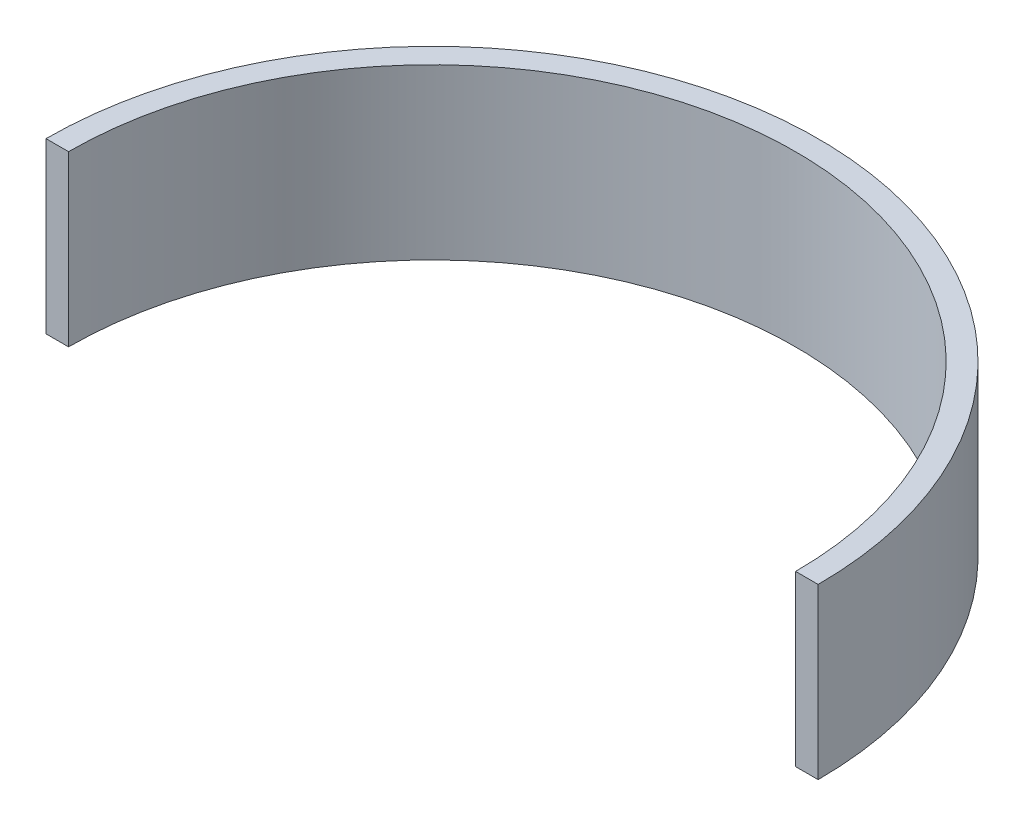
ISO-10303-21;
HEADER;
FILE_DESCRIPTION(('STEP AP214'),'2;1');
FILE_NAME('part.step','',(''),(''),'','','');
FILE_SCHEMA(('AUTOMOTIVE_DESIGN { 1 0 10303 214 1 1 1 1 }'));
ENDSEC;
DATA;
#1=APPLICATION_CONTEXT('core data for automotive mechanical design processes');
#2=APPLICATION_PROTOCOL_DEFINITION('international standard','automotive_design',2000,#1);
#3=PRODUCT_CONTEXT('',#1,'mechanical');
#4=PRODUCT('Part','Part','',(#3));
#5=PRODUCT_RELATED_PRODUCT_CATEGORY('part','',(#4));
#6=PRODUCT_DEFINITION_FORMATION('','',#4);
#7=PRODUCT_DEFINITION_CONTEXT('part definition',#1,'design');
#8=PRODUCT_DEFINITION('design','',#6,#7);
#9=PRODUCT_DEFINITION_SHAPE('','',#8);
#10=(LENGTH_UNIT() NAMED_UNIT(*) SI_UNIT(.MILLI.,.METRE.));
#11=(NAMED_UNIT(*) PLANE_ANGLE_UNIT() SI_UNIT($,.RADIAN.));
#12=(NAMED_UNIT(*) SI_UNIT($,.STERADIAN.) SOLID_ANGLE_UNIT());
#13=UNCERTAINTY_MEASURE_WITH_UNIT(LENGTH_MEASURE(1.E-05),#10,'distance_accuracy_value','');
#14=(GEOMETRIC_REPRESENTATION_CONTEXT(3) GLOBAL_UNCERTAINTY_ASSIGNED_CONTEXT((#13)) GLOBAL_UNIT_ASSIGNED_CONTEXT((#10,
#11,#12)) REPRESENTATION_CONTEXT('',''));
#15=CARTESIAN_POINT('',(0.,0.,0.));
#16=DIRECTION('',(0.,0.,1.));
#17=DIRECTION('',(1.,0.,0.));
#18=AXIS2_PLACEMENT_3D('',#15,#16,#17);
#19=CARTESIAN_POINT('',(0.,0.,0.));
#20=DIRECTION('',(0.,0.,1.));
#21=DIRECTION('',(1.,0.,0.));
#22=AXIS2_PLACEMENT_3D('',#19,#20,#21);
#23=PLANE('',#22);
#24=DIRECTION('',(1.,0.,0.));
#25=VECTOR('',#24,1.);
#26=CARTESIAN_POINT('',(0.,15.,0.));
#27=LINE('',#26,#25);
#28=CARTESIAN_POINT('',(-34.25,15.,0.));
#29=VERTEX_POINT('',#28);
#30=CARTESIAN_POINT('',(-32.25,15.,0.));
#31=VERTEX_POINT('',#30);
#32=EDGE_CURVE('E92',#29,#31,#27,.T.);
#33=ORIENTED_EDGE('',*,*,#32,.F.);
#34=DIRECTION('',(0.,-1.,0.));
#35=VECTOR('',#34,1.);
#36=CARTESIAN_POINT('',(-34.25,15.,0.));
#37=LINE('',#36,#35);
#38=CARTESIAN_POINT('',(-34.25,0.,0.));
#39=VERTEX_POINT('',#38);
#40=EDGE_CURVE('E84',#29,#39,#37,.T.);
#41=ORIENTED_EDGE('',*,*,#40,.T.);
#42=DIRECTION('',(1.,0.,0.));
#43=VECTOR('',#42,1.);
#44=CARTESIAN_POINT('',(0.,0.,0.));
#45=LINE('',#44,#43);
#46=CARTESIAN_POINT('',(-32.25,0.,0.));
#47=VERTEX_POINT('',#46);
#48=EDGE_CURVE('E104',#39,#47,#45,.T.);
#49=ORIENTED_EDGE('',*,*,#48,.T.);
#50=DIRECTION('',(0.,-1.,0.));
#51=VECTOR('',#50,1.);
#52=CARTESIAN_POINT('',(-32.25,15.,0.));
#53=LINE('',#52,#51);
#54=EDGE_CURVE('E58',#31,#47,#53,.T.);
#55=ORIENTED_EDGE('',*,*,#54,.F.);
#56=EDGE_LOOP('',(#33,#41,#49,#55));
#57=FACE_BOUND('',#56,.T.);
#58=ADVANCED_FACE('F35',(#57),#23,.T.);
#59=CARTESIAN_POINT('',(32.25,0.,0.));
#60=VERTEX_POINT('',#59);
#61=CARTESIAN_POINT('',(34.25,0.,0.));
#62=VERTEX_POINT('',#61);
#63=EDGE_CURVE('E97',#60,#62,#45,.T.);
#64=ORIENTED_EDGE('',*,*,#63,.T.);
#65=DIRECTION('',(0.,-1.,0.));
#66=VECTOR('',#65,1.);
#67=CARTESIAN_POINT('',(34.25,15.,0.));
#68=LINE('',#67,#66);
#69=CARTESIAN_POINT('',(34.25,15.,0.));
#70=VERTEX_POINT('',#69);
#71=EDGE_CURVE('E82',#62,#70,#68,.F.);
#72=ORIENTED_EDGE('',*,*,#71,.T.);
#73=CARTESIAN_POINT('',(32.25,15.,0.));
#74=VERTEX_POINT('',#73);
#75=EDGE_CURVE('E89',#74,#70,#27,.T.);
#76=ORIENTED_EDGE('',*,*,#75,.F.);
#77=DIRECTION('',(0.,-1.,0.));
#78=VECTOR('',#77,1.);
#79=CARTESIAN_POINT('',(32.25,15.,0.));
#80=LINE('',#79,#78);
#81=EDGE_CURVE('E50',#60,#74,#80,.F.);
#82=ORIENTED_EDGE('',*,*,#81,.F.);
#83=EDGE_LOOP('',(#64,#72,#76,#82));
#84=FACE_BOUND('',#83,.T.);
#85=ADVANCED_FACE('F95',(#84),#23,.T.);
#86=CARTESIAN_POINT('',(0.,0.,0.));
#87=DIRECTION('',(0.,1.,0.));
#88=DIRECTION('',(0.,0.,1.));
#89=AXIS2_PLACEMENT_3D('',#86,#87,#88);
#90=PLANE('',#89);
#91=ORIENTED_EDGE('',*,*,#48,.F.);
#92=CARTESIAN_POINT('',(0.,0.,0.));
#93=DIRECTION('',(0.,1.,0.));
#94=DIRECTION('',(0.,0.,1.));
#95=AXIS2_PLACEMENT_3D('',#92,#93,#94);
#96=CIRCLE('',#95,34.25);
#97=EDGE_CURVE('E86',#62,#39,#96,.T.);
#98=ORIENTED_EDGE('',*,*,#97,.F.);
#99=ORIENTED_EDGE('',*,*,#63,.F.);
#100=CARTESIAN_POINT('',(0.,0.,0.));
#101=DIRECTION('',(0.,1.,0.));
#102=DIRECTION('',(0.,0.,1.));
#103=AXIS2_PLACEMENT_3D('',#100,#101,#102);
#104=CIRCLE('',#103,32.25);
#105=EDGE_CURVE('E11',#60,#47,#104,.T.);
#106=ORIENTED_EDGE('',*,*,#105,.T.);
#107=EDGE_LOOP('',(#91,#98,#99,#106));
#108=FACE_BOUND('',#107,.T.);
#109=ADVANCED_FACE('F106',(#108),#90,.F.);
#110=CARTESIAN_POINT('',(0.,15.,0.));
#111=DIRECTION('',(0.,1.,0.));
#112=DIRECTION('',(0.,0.,1.));
#113=AXIS2_PLACEMENT_3D('',#110,#111,#112);
#114=PLANE('',#113);
#115=CARTESIAN_POINT('',(0.,15.,0.));
#116=DIRECTION('',(0.,1.,0.));
#117=DIRECTION('',(0.,0.,1.));
#118=AXIS2_PLACEMENT_3D('',#115,#116,#117);
#119=CIRCLE('',#118,34.25);
#120=EDGE_CURVE('E78',#70,#29,#119,.T.);
#121=ORIENTED_EDGE('',*,*,#120,.T.);
#122=ORIENTED_EDGE('',*,*,#32,.T.);
#123=CARTESIAN_POINT('',(0.,15.,0.));
#124=DIRECTION('',(0.,1.,0.));
#125=DIRECTION('',(0.,0.,1.));
#126=AXIS2_PLACEMENT_3D('',#123,#124,#125);
#127=CIRCLE('',#126,32.25);
#128=EDGE_CURVE('E43',#74,#31,#127,.T.);
#129=ORIENTED_EDGE('',*,*,#128,.F.);
#130=ORIENTED_EDGE('',*,*,#75,.T.);
#131=EDGE_LOOP('',(#121,#122,#129,#130));
#132=FACE_BOUND('',#131,.T.);
#133=ADVANCED_FACE('F90',(#132),#114,.T.);
#134=CARTESIAN_POINT('',(0.,15.,0.));
#135=DIRECTION('',(0.,-1.,0.));
#136=DIRECTION('',(0.,0.,-1.));
#137=AXIS2_PLACEMENT_3D('',#134,#135,#136);
#138=CYLINDRICAL_SURFACE('',#137,32.25);
#139=ORIENTED_EDGE('',*,*,#128,.T.);
#140=ORIENTED_EDGE('',*,*,#54,.T.);
#141=ORIENTED_EDGE('',*,*,#105,.F.);
#142=ORIENTED_EDGE('',*,*,#81,.T.);
#143=EDGE_LOOP('',(#139,#140,#141,#142));
#144=FACE_BOUND('',#143,.T.);
#145=ADVANCED_FACE('F37',(#144),#138,.F.);
#146=CARTESIAN_POINT('',(0.,15.,0.));
#147=DIRECTION('',(0.,-1.,0.));
#148=DIRECTION('',(0.,0.,-1.));
#149=AXIS2_PLACEMENT_3D('',#146,#147,#148);
#150=CYLINDRICAL_SURFACE('',#149,34.25);
#151=ORIENTED_EDGE('',*,*,#40,.F.);
#152=ORIENTED_EDGE('',*,*,#120,.F.);
#153=ORIENTED_EDGE('',*,*,#71,.F.);
#154=ORIENTED_EDGE('',*,*,#97,.T.);
#155=EDGE_LOOP('',(#151,#152,#153,#154));
#156=FACE_BOUND('',#155,.T.);
#157=ADVANCED_FACE('F80',(#156),#150,.T.);
#158=CLOSED_SHELL('',(#58,#85,#109,#133,#145,#157));
#159=MANIFOLD_SOLID_BREP('B2',#158);
#160=ADVANCED_BREP_SHAPE_REPRESENTATION('',(#18,#159),#14);
#161=SHAPE_DEFINITION_REPRESENTATION(#9,#160);
ENDSEC;
END-ISO-10303-21;
